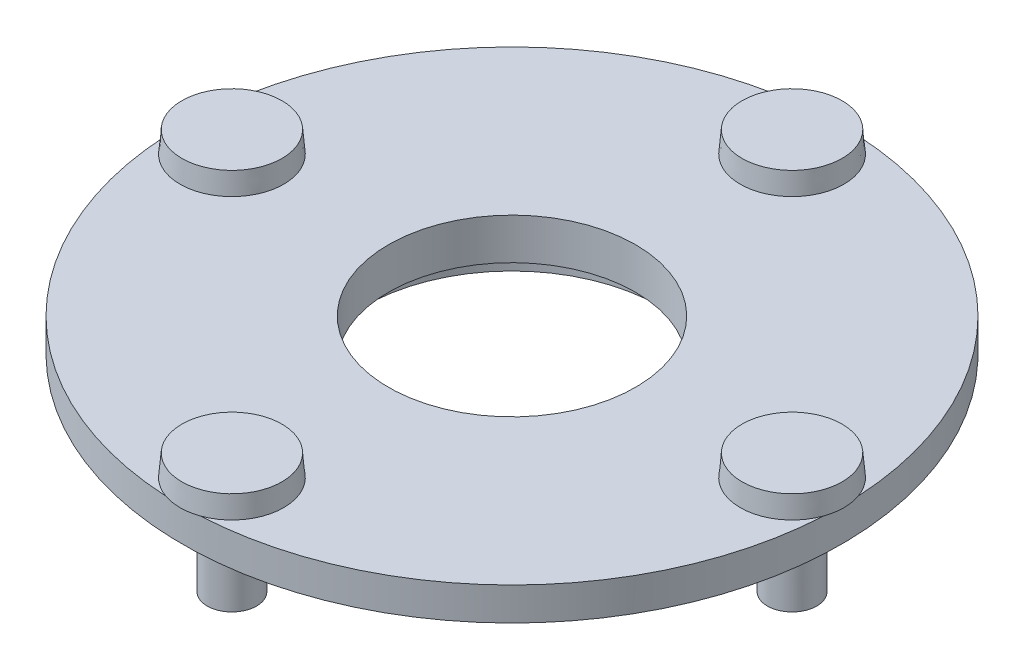
ISO-10303-21;
HEADER;
FILE_DESCRIPTION(('STEP AP214'),'2;1');
FILE_NAME('part.step','',(''),(''),'','','');
FILE_SCHEMA(('AUTOMOTIVE_DESIGN { 1 0 10303 214 1 1 1 1 }'));
ENDSEC;
DATA;
#1=APPLICATION_CONTEXT('core data for automotive mechanical design processes');
#2=APPLICATION_PROTOCOL_DEFINITION('international standard','automotive_design',2000,#1);
#3=PRODUCT_CONTEXT('',#1,'mechanical');
#4=PRODUCT('Part','Part','',(#3));
#5=PRODUCT_RELATED_PRODUCT_CATEGORY('part','',(#4));
#6=PRODUCT_DEFINITION_FORMATION('','',#4);
#7=PRODUCT_DEFINITION_CONTEXT('part definition',#1,'design');
#8=PRODUCT_DEFINITION('design','',#6,#7);
#9=PRODUCT_DEFINITION_SHAPE('','',#8);
#10=(LENGTH_UNIT() NAMED_UNIT(*) SI_UNIT(.MILLI.,.METRE.));
#11=(NAMED_UNIT(*) PLANE_ANGLE_UNIT() SI_UNIT($,.RADIAN.));
#12=(NAMED_UNIT(*) SI_UNIT($,.STERADIAN.) SOLID_ANGLE_UNIT());
#13=UNCERTAINTY_MEASURE_WITH_UNIT(LENGTH_MEASURE(1.E-05),#10,'distance_accuracy_value','');
#14=(GEOMETRIC_REPRESENTATION_CONTEXT(3) GLOBAL_UNCERTAINTY_ASSIGNED_CONTEXT((#13)) GLOBAL_UNIT_ASSIGNED_CONTEXT((#10,
#11,#12)) REPRESENTATION_CONTEXT('',''));
#15=CARTESIAN_POINT('',(0.,0.,0.));
#16=DIRECTION('',(0.,0.,1.));
#17=DIRECTION('',(1.,0.,0.));
#18=AXIS2_PLACEMENT_3D('',#15,#16,#17);
#19=CARTESIAN_POINT('',(20.,2.,0.));
#20=DIRECTION('',(0.,1.,0.));
#21=DIRECTION('',(0.,0.,1.));
#22=AXIS2_PLACEMENT_3D('',#19,#20,#21);
#23=PLANE('',#22);
#24=CARTESIAN_POINT('',(-17.,2.,0.));
#25=DIRECTION('',(0.,1.,0.));
#26=DIRECTION('',(0.,0.,1.));
#27=AXIS2_PLACEMENT_3D('',#24,#25,#26);
#28=CIRCLE('',#27,1.5);
#29=CARTESIAN_POINT('',(-17.,2.,1.5));
#30=VERTEX_POINT('',#29);
#31=EDGE_CURVE('E150',#30,#30,#28,.F.);
#32=ORIENTED_EDGE('',*,*,#31,.F.);
#33=EDGE_LOOP('',(#32));
#34=FACE_BOUND('',#33,.T.);
#35=CARTESIAN_POINT('',(17.,2.,0.));
#36=DIRECTION('',(0.,1.,0.));
#37=DIRECTION('',(0.,0.,1.));
#38=AXIS2_PLACEMENT_3D('',#35,#36,#37);
#39=CIRCLE('',#38,1.5);
#40=CARTESIAN_POINT('',(17.,2.,1.5));
#41=VERTEX_POINT('',#40);
#42=EDGE_CURVE('E144',#41,#41,#39,.F.);
#43=ORIENTED_EDGE('',*,*,#42,.F.);
#44=EDGE_LOOP('',(#43));
#45=FACE_BOUND('',#44,.T.);
#46=CARTESIAN_POINT('',(0.,2.,0.));
#47=DIRECTION('',(0.,-1.,0.));
#48=DIRECTION('',(0.,0.,-1.));
#49=AXIS2_PLACEMENT_3D('',#46,#47,#48);
#50=CIRCLE('',#49,14.);
#51=CARTESIAN_POINT('',(0.,2.,-14.));
#52=VERTEX_POINT('',#51);
#53=EDGE_CURVE('E133',#52,#52,#50,.T.);
#54=ORIENTED_EDGE('',*,*,#53,.F.);
#55=EDGE_LOOP('',(#54));
#56=FACE_BOUND('',#55,.T.);
#57=CARTESIAN_POINT('',(0.,2.,0.));
#58=DIRECTION('',(0.,-1.,0.));
#59=DIRECTION('',(0.,0.,-1.));
#60=AXIS2_PLACEMENT_3D('',#57,#58,#59);
#61=CIRCLE('',#60,20.);
#62=CARTESIAN_POINT('',(0.,2.,-20.));
#63=VERTEX_POINT('',#62);
#64=EDGE_CURVE('E136',#63,#63,#61,.T.);
#65=ORIENTED_EDGE('',*,*,#64,.T.);
#66=EDGE_LOOP('',(#65));
#67=FACE_BOUND('',#66,.T.);
#68=CARTESIAN_POINT('',(0.,2.,17.));
#69=DIRECTION('',(0.,1.,0.));
#70=DIRECTION('',(0.,0.,1.));
#71=AXIS2_PLACEMENT_3D('',#68,#69,#70);
#72=CIRCLE('',#71,1.5);
#73=CARTESIAN_POINT('',(0.,2.,18.5));
#74=VERTEX_POINT('',#73);
#75=EDGE_CURVE('E147',#74,#74,#72,.F.);
#76=ORIENTED_EDGE('',*,*,#75,.F.);
#77=EDGE_LOOP('',(#76));
#78=FACE_BOUND('',#77,.T.);
#79=CARTESIAN_POINT('',(1.78065548281E-13,2.,-17.));
#80=DIRECTION('',(0.,1.,0.));
#81=DIRECTION('',(0.,0.,1.));
#82=AXIS2_PLACEMENT_3D('',#79,#80,#81);
#83=CIRCLE('',#82,1.5);
#84=CARTESIAN_POINT('',(1.78065548281E-13,2.,-15.5));
#85=VERTEX_POINT('',#84);
#86=EDGE_CURVE('E153',#85,#85,#83,.F.);
#87=ORIENTED_EDGE('',*,*,#86,.F.);
#88=EDGE_LOOP('',(#87));
#89=FACE_BOUND('',#88,.T.);
#90=ADVANCED_FACE('F41',(#34,#45,#56,#67,#78,#89),#23,.F.);
#91=CARTESIAN_POINT('',(7.5,4.,0.));
#92=DIRECTION('',(0.,1.,0.));
#93=DIRECTION('',(0.,0.,1.));
#94=AXIS2_PLACEMENT_3D('',#91,#92,#93);
#95=PLANE('',#94);
#96=CARTESIAN_POINT('',(0.,4.,0.));
#97=DIRECTION('',(0.,-1.,0.));
#98=DIRECTION('',(0.,0.,-1.));
#99=AXIS2_PLACEMENT_3D('',#96,#97,#98);
#100=CIRCLE('',#99,7.5);
#101=CARTESIAN_POINT('',(0.,4.,-7.5));
#102=VERTEX_POINT('',#101);
#103=EDGE_CURVE('E140',#102,#102,#100,.T.);
#104=ORIENTED_EDGE('',*,*,#103,.T.);
#105=EDGE_LOOP('',(#104));
#106=FACE_BOUND('',#105,.T.);
#107=CARTESIAN_POINT('',(0.,4.,0.));
#108=DIRECTION('',(0.,-1.,0.));
#109=DIRECTION('',(0.,0.,-1.));
#110=AXIS2_PLACEMENT_3D('',#107,#108,#109);
#111=CIRCLE('',#110,20.);
#112=CARTESIAN_POINT('',(1.04142112186732,4.,-19.9728676470588));
#113=VERTEX_POINT('',#112);
#114=CARTESIAN_POINT('',(19.9728676470588,4.,-1.04142112186716));
#115=VERTEX_POINT('',#114);
#116=EDGE_CURVE('E90',#113,#115,#111,.T.);
#117=ORIENTED_EDGE('',*,*,#116,.F.);
#118=CARTESIAN_POINT('',(1.78065548281E-13,4.,-17.));
#119=DIRECTION('',(0.,1.,0.));
#120=DIRECTION('',(1.,0.,0.));
#121=AXIS2_PLACEMENT_3D('',#118,#119,#120);
#122=CIRCLE('',#121,3.15);
#123=CARTESIAN_POINT('',(-1.0414211218669,4.,-19.9728676470588));
#124=VERTEX_POINT('',#123);
#125=EDGE_CURVE('E55',#124,#113,#122,.T.);
#126=ORIENTED_EDGE('',*,*,#125,.F.);
#127=CARTESIAN_POINT('',(-19.9728676470588,4.,-1.04142112186711));
#128=VERTEX_POINT('',#127);
#129=EDGE_CURVE('E89',#128,#124,#111,.T.);
#130=ORIENTED_EDGE('',*,*,#129,.F.);
#131=CARTESIAN_POINT('',(-17.,4.,0.));
#132=DIRECTION('',(0.,1.,0.));
#133=DIRECTION('',(0.,0.,-1.));
#134=AXIS2_PLACEMENT_3D('',#131,#132,#133);
#135=CIRCLE('',#134,3.15);
#136=CARTESIAN_POINT('',(-19.9728676470588,4.,1.04142112186711));
#137=VERTEX_POINT('',#136);
#138=EDGE_CURVE('E62',#137,#128,#135,.T.);
#139=ORIENTED_EDGE('',*,*,#138,.F.);
#140=CARTESIAN_POINT('',(-1.04142112186718,4.,19.9728676470588));
#141=VERTEX_POINT('',#140);
#142=EDGE_CURVE('E308',#141,#137,#111,.T.);
#143=ORIENTED_EDGE('',*,*,#142,.F.);
#144=CARTESIAN_POINT('',(0.,4.,17.));
#145=DIRECTION('',(0.,1.,0.));
#146=DIRECTION('',(-1.,0.,0.));
#147=AXIS2_PLACEMENT_3D('',#144,#145,#146);
#148=CIRCLE('',#147,3.15);
#149=CARTESIAN_POINT('',(1.04142112186704,4.,19.9728676470588));
#150=VERTEX_POINT('',#149);
#151=EDGE_CURVE('E110',#150,#141,#148,.T.);
#152=ORIENTED_EDGE('',*,*,#151,.F.);
#153=CARTESIAN_POINT('',(19.9728676470588,4.,1.04142112186715));
#154=VERTEX_POINT('',#153);
#155=EDGE_CURVE('E141',#154,#150,#111,.T.);
#156=ORIENTED_EDGE('',*,*,#155,.F.);
#157=CARTESIAN_POINT('',(17.,4.,0.));
#158=DIRECTION('',(0.,1.,0.));
#159=DIRECTION('',(0.,0.,1.));
#160=AXIS2_PLACEMENT_3D('',#157,#158,#159);
#161=CIRCLE('',#160,3.15);
#162=EDGE_CURVE('E121',#115,#154,#161,.T.);
#163=ORIENTED_EDGE('',*,*,#162,.F.);
#164=EDGE_LOOP('',(#117,#126,#130,#139,#143,#152,#156,#163));
#165=FACE_BOUND('',#164,.T.);
#166=ADVANCED_FACE('F94',(#106,#165),#95,.T.);
#167=CARTESIAN_POINT('',(0.,-5.17637943196313,0.));
#168=DIRECTION('',(0.,-1.,0.));
#169=DIRECTION('',(0.,0.,-1.));
#170=AXIS2_PLACEMENT_3D('',#167,#168,#169);
#171=CYLINDRICAL_SURFACE('',#170,7.5);
#172=CARTESIAN_POINT('',(0.,1.5,0.));
#173=DIRECTION('',(0.,-1.,0.));
#174=DIRECTION('',(0.,0.,-1.));
#175=AXIS2_PLACEMENT_3D('',#172,#173,#174);
#176=CIRCLE('',#175,7.5);
#177=CARTESIAN_POINT('',(0.,1.5,-7.5));
#178=VERTEX_POINT('',#177);
#179=EDGE_CURVE('E127',#178,#178,#176,.T.);
#180=ORIENTED_EDGE('',*,*,#179,.T.);
#181=EDGE_LOOP('',(#180));
#182=FACE_BOUND('',#181,.T.);
#183=ORIENTED_EDGE('',*,*,#103,.F.);
#184=EDGE_LOOP('',(#183));
#185=FACE_BOUND('',#184,.T.);
#186=ADVANCED_FACE('F182',(#182,#185),#171,.F.);
#187=CARTESIAN_POINT('',(0.,-5.17637943196313,0.));
#188=DIRECTION('',(0.,-1.,0.));
#189=DIRECTION('',(0.,0.,-1.));
#190=AXIS2_PLACEMENT_3D('',#187,#188,#189);
#191=CYLINDRICAL_SURFACE('',#190,20.);
#192=ORIENTED_EDGE('',*,*,#64,.F.);
#193=EDGE_LOOP('',(#192));
#194=FACE_BOUND('',#193,.T.);
#195=EDGE_CURVE('E138',#115,#154,#111,.T.);
#196=ORIENTED_EDGE('',*,*,#195,.T.);
#197=ORIENTED_EDGE('',*,*,#155,.T.);
#198=EDGE_CURVE('E312',#150,#141,#111,.T.);
#199=ORIENTED_EDGE('',*,*,#198,.T.);
#200=ORIENTED_EDGE('',*,*,#142,.T.);
#201=EDGE_CURVE('E102',#137,#128,#111,.T.);
#202=ORIENTED_EDGE('',*,*,#201,.T.);
#203=ORIENTED_EDGE('',*,*,#129,.T.);
#204=EDGE_CURVE('E83',#124,#113,#111,.T.);
#205=ORIENTED_EDGE('',*,*,#204,.T.);
#206=ORIENTED_EDGE('',*,*,#116,.T.);
#207=EDGE_LOOP('',(#196,#197,#199,#200,#202,#203,#205,#206));
#208=FACE_BOUND('',#207,.T.);
#209=ADVANCED_FACE('F100',(#194,#208),#191,.T.);
#210=CARTESIAN_POINT('',(7.5,0.,0.));
#211=DIRECTION('',(0.,-1.,0.));
#212=DIRECTION('',(0.,0.,-1.));
#213=AXIS2_PLACEMENT_3D('',#210,#211,#212);
#214=PLANE('',#213);
#215=CARTESIAN_POINT('',(0.,0.,0.));
#216=DIRECTION('',(0.,-1.,0.));
#217=DIRECTION('',(0.,0.,-1.));
#218=AXIS2_PLACEMENT_3D('',#215,#216,#217);
#219=CIRCLE('',#218,9.);
#220=CARTESIAN_POINT('',(0.,0.,-9.));
#221=VERTEX_POINT('',#220);
#222=EDGE_CURVE('E120',#221,#221,#219,.T.);
#223=ORIENTED_EDGE('',*,*,#222,.F.);
#224=EDGE_LOOP('',(#223));
#225=FACE_BOUND('',#224,.T.);
#226=CARTESIAN_POINT('',(0.,0.,0.));
#227=DIRECTION('',(0.,-1.,0.));
#228=DIRECTION('',(0.,0.,-1.));
#229=AXIS2_PLACEMENT_3D('',#226,#227,#228);
#230=CIRCLE('',#229,14.);
#231=CARTESIAN_POINT('',(0.,0.,-14.));
#232=VERTEX_POINT('',#231);
#233=EDGE_CURVE('E130',#232,#232,#230,.T.);
#234=ORIENTED_EDGE('',*,*,#233,.T.);
#235=EDGE_LOOP('',(#234));
#236=FACE_BOUND('',#235,.T.);
#237=ADVANCED_FACE('F191',(#225,#236),#214,.T.);
#238=CARTESIAN_POINT('',(0.,-1.23339827522804,0.));
#239=DIRECTION('',(0.,-1.,0.));
#240=DIRECTION('',(0.,0.,-1.));
#241=AXIS2_PLACEMENT_3D('',#238,#239,#240);
#242=CYLINDRICAL_SURFACE('',#241,14.);
#243=ORIENTED_EDGE('',*,*,#233,.F.);
#244=EDGE_LOOP('',(#243));
#245=FACE_BOUND('',#244,.T.);
#246=ORIENTED_EDGE('',*,*,#53,.T.);
#247=EDGE_LOOP('',(#246));
#248=FACE_BOUND('',#247,.T.);
#249=ADVANCED_FACE('F189',(#245,#248),#242,.T.);
#250=CARTESIAN_POINT('',(7.5,1.5,0.));
#251=DIRECTION('',(0.,1.,0.));
#252=DIRECTION('',(0.,0.,1.));
#253=AXIS2_PLACEMENT_3D('',#250,#251,#252);
#254=PLANE('',#253);
#255=ORIENTED_EDGE('',*,*,#179,.F.);
#256=EDGE_LOOP('',(#255));
#257=FACE_BOUND('',#256,.T.);
#258=CARTESIAN_POINT('',(0.,1.5,0.));
#259=DIRECTION('',(0.,-1.,0.));
#260=DIRECTION('',(0.,0.,-1.));
#261=AXIS2_PLACEMENT_3D('',#258,#259,#260);
#262=CIRCLE('',#261,9.);
#263=CARTESIAN_POINT('',(0.,1.5,-9.));
#264=VERTEX_POINT('',#263);
#265=EDGE_CURVE('E124',#264,#264,#262,.T.);
#266=ORIENTED_EDGE('',*,*,#265,.T.);
#267=EDGE_LOOP('',(#266));
#268=FACE_BOUND('',#267,.T.);
#269=ADVANCED_FACE('F249',(#257,#268),#254,.F.);
#270=CARTESIAN_POINT('',(0.,-1.23339827522804,0.));
#271=DIRECTION('',(0.,-1.,0.));
#272=DIRECTION('',(0.,0.,-1.));
#273=AXIS2_PLACEMENT_3D('',#270,#271,#272);
#274=CYLINDRICAL_SURFACE('',#273,9.);
#275=ORIENTED_EDGE('',*,*,#265,.F.);
#276=EDGE_LOOP('',(#275));
#277=FACE_BOUND('',#276,.T.);
#278=ORIENTED_EDGE('',*,*,#222,.T.);
#279=EDGE_LOOP('',(#278));
#280=FACE_BOUND('',#279,.T.);
#281=ADVANCED_FACE('F243',(#277,#280),#274,.F.);
#282=CARTESIAN_POINT('',(17.,5.3,0.));
#283=DIRECTION('',(0.,1.,0.));
#284=DIRECTION('',(0.,0.,1.));
#285=AXIS2_PLACEMENT_3D('',#282,#283,#284);
#286=PLANE('',#285);
#287=CARTESIAN_POINT('',(17.,5.3,0.));
#288=DIRECTION('',(0.,1.,0.));
#289=DIRECTION('',(0.,0.,1.));
#290=AXIS2_PLACEMENT_3D('',#287,#288,#289);
#291=CIRCLE('',#290,3.03626473741632);
#292=CARTESIAN_POINT('',(17.,5.3,3.03626473741632));
#293=VERTEX_POINT('',#292);
#294=EDGE_CURVE('E11',#293,#293,#291,.T.);
#295=ORIENTED_EDGE('',*,*,#294,.T.);
#296=EDGE_LOOP('',(#295));
#297=FACE_BOUND('',#296,.T.);
#298=ADVANCED_FACE('F240',(#297),#286,.T.);
#299=CARTESIAN_POINT('',(17.,4.,0.));
#300=DIRECTION('',(0.,1.,0.));
#301=DIRECTION('',(0.,0.,1.));
#302=AXIS2_PLACEMENT_3D('',#299,#300,#301);
#303=PLANE('',#302);
#304=ORIENTED_EDGE('',*,*,#195,.F.);
#305=EDGE_CURVE('E117',#154,#115,#161,.T.);
#306=ORIENTED_EDGE('',*,*,#305,.F.);
#307=EDGE_LOOP('',(#304,#306));
#308=FACE_BOUND('',#307,.T.);
#309=ADVANCED_FACE('F238',(#308),#303,.F.);
#310=CARTESIAN_POINT('',(17.,-2.,0.));
#311=DIRECTION('',(0.,1.,0.));
#312=DIRECTION('',(0.,0.,1.));
#313=AXIS2_PLACEMENT_3D('',#310,#311,#312);
#314=CYLINDRICAL_SURFACE('',#313,1.5);
#315=CARTESIAN_POINT('',(17.,-2.,0.));
#316=DIRECTION('',(0.,-1.,0.));
#317=DIRECTION('',(0.,0.,-1.));
#318=AXIS2_PLACEMENT_3D('',#315,#316,#317);
#319=CIRCLE('',#318,1.5);
#320=CARTESIAN_POINT('',(17.,-2.,-1.5));
#321=VERTEX_POINT('',#320);
#322=EDGE_CURVE('E114',#321,#321,#319,.T.);
#323=ORIENTED_EDGE('',*,*,#322,.F.);
#324=EDGE_LOOP('',(#323));
#325=FACE_BOUND('',#324,.T.);
#326=ORIENTED_EDGE('',*,*,#42,.T.);
#327=EDGE_LOOP('',(#326));
#328=FACE_BOUND('',#327,.T.);
#329=ADVANCED_FACE('F229',(#325,#328),#314,.T.);
#330=CARTESIAN_POINT('',(17.,-2.,0.));
#331=DIRECTION('',(0.,-1.,0.));
#332=DIRECTION('',(0.,0.,-1.));
#333=AXIS2_PLACEMENT_3D('',#330,#331,#332);
#334=PLANE('',#333);
#335=ORIENTED_EDGE('',*,*,#322,.T.);
#336=EDGE_LOOP('',(#335));
#337=FACE_BOUND('',#336,.T.);
#338=ADVANCED_FACE('F219',(#337),#334,.T.);
#339=CARTESIAN_POINT('',(0.,5.3,17.));
#340=DIRECTION('',(0.,1.,0.));
#341=DIRECTION('',(-1.,0.,0.));
#342=AXIS2_PLACEMENT_3D('',#339,#340,#341);
#343=PLANE('',#342);
#344=CARTESIAN_POINT('',(0.,5.3,17.));
#345=DIRECTION('',(0.,1.,0.));
#346=DIRECTION('',(0.,0.,1.));
#347=AXIS2_PLACEMENT_3D('',#344,#345,#346);
#348=CIRCLE('',#347,3.03626473741632);
#349=CARTESIAN_POINT('',(0.,5.3,20.0362647374163));
#350=VERTEX_POINT('',#349);
#351=EDGE_CURVE('E156',#350,#350,#348,.T.);
#352=ORIENTED_EDGE('',*,*,#351,.T.);
#353=EDGE_LOOP('',(#352));
#354=FACE_BOUND('',#353,.T.);
#355=ADVANCED_FACE('F216',(#354),#343,.T.);
#356=CARTESIAN_POINT('',(0.,4.,17.));
#357=DIRECTION('',(0.,1.,0.));
#358=DIRECTION('',(-1.,0.,0.));
#359=AXIS2_PLACEMENT_3D('',#356,#357,#358);
#360=PLANE('',#359);
#361=ORIENTED_EDGE('',*,*,#198,.F.);
#362=EDGE_CURVE('E111',#141,#150,#148,.T.);
#363=ORIENTED_EDGE('',*,*,#362,.F.);
#364=EDGE_LOOP('',(#361,#363));
#365=FACE_BOUND('',#364,.T.);
#366=ADVANCED_FACE('F218',(#365),#360,.F.);
#367=CARTESIAN_POINT('',(-17.,5.3,0.));
#368=DIRECTION('',(0.,1.,0.));
#369=DIRECTION('',(0.,0.,-1.));
#370=AXIS2_PLACEMENT_3D('',#367,#368,#369);
#371=PLANE('',#370);
#372=CARTESIAN_POINT('',(-17.,5.3,0.));
#373=DIRECTION('',(0.,1.,0.));
#374=DIRECTION('',(0.,0.,1.));
#375=AXIS2_PLACEMENT_3D('',#372,#373,#374);
#376=CIRCLE('',#375,3.03626473741632);
#377=CARTESIAN_POINT('',(-17.,5.3,3.03626473741632));
#378=VERTEX_POINT('',#377);
#379=EDGE_CURVE('E159',#378,#378,#376,.T.);
#380=ORIENTED_EDGE('',*,*,#379,.T.);
#381=EDGE_LOOP('',(#380));
#382=FACE_BOUND('',#381,.T.);
#383=ADVANCED_FACE('F226',(#382),#371,.T.);
#384=CARTESIAN_POINT('',(-17.,4.,0.));
#385=DIRECTION('',(0.,1.,0.));
#386=DIRECTION('',(0.,0.,-1.));
#387=AXIS2_PLACEMENT_3D('',#384,#385,#386);
#388=PLANE('',#387);
#389=ORIENTED_EDGE('',*,*,#201,.F.);
#390=EDGE_CURVE('E105',#128,#137,#135,.T.);
#391=ORIENTED_EDGE('',*,*,#390,.F.);
#392=EDGE_LOOP('',(#389,#391));
#393=FACE_BOUND('',#392,.T.);
#394=ADVANCED_FACE('F233',(#393),#388,.F.);
#395=CARTESIAN_POINT('',(1.78065548281E-13,5.3,-17.));
#396=DIRECTION('',(0.,1.,0.));
#397=DIRECTION('',(1.,0.,0.));
#398=AXIS2_PLACEMENT_3D('',#395,#396,#397);
#399=PLANE('',#398);
#400=CARTESIAN_POINT('',(1.78065548281E-13,5.3,-17.));
#401=DIRECTION('',(0.,1.,0.));
#402=DIRECTION('',(0.,0.,1.));
#403=AXIS2_PLACEMENT_3D('',#400,#401,#402);
#404=CIRCLE('',#403,3.03626473741632);
#405=CARTESIAN_POINT('',(1.78065548281E-13,5.3,-13.9637352625837));
#406=VERTEX_POINT('',#405);
#407=EDGE_CURVE('E49',#406,#406,#404,.T.);
#408=ORIENTED_EDGE('',*,*,#407,.T.);
#409=EDGE_LOOP('',(#408));
#410=FACE_BOUND('',#409,.T.);
#411=ADVANCED_FACE('F164',(#410),#399,.T.);
#412=CARTESIAN_POINT('',(1.78065548281E-13,4.,-17.));
#413=DIRECTION('',(0.,1.,0.));
#414=DIRECTION('',(1.,0.,0.));
#415=AXIS2_PLACEMENT_3D('',#412,#413,#414);
#416=PLANE('',#415);
#417=ORIENTED_EDGE('',*,*,#204,.F.);
#418=EDGE_CURVE('E85',#113,#124,#122,.T.);
#419=ORIENTED_EDGE('',*,*,#418,.F.);
#420=EDGE_LOOP('',(#417,#419));
#421=FACE_BOUND('',#420,.T.);
#422=ADVANCED_FACE('F84',(#421),#416,.F.);
#423=CARTESIAN_POINT('',(0.,-2.,17.));
#424=DIRECTION('',(0.,1.,0.));
#425=DIRECTION('',(0.,0.,1.));
#426=AXIS2_PLACEMENT_3D('',#423,#424,#425);
#427=CYLINDRICAL_SURFACE('',#426,1.5);
#428=CARTESIAN_POINT('',(0.,-2.,17.));
#429=DIRECTION('',(0.,-1.,0.));
#430=DIRECTION('',(1.,0.,0.));
#431=AXIS2_PLACEMENT_3D('',#428,#429,#430);
#432=CIRCLE('',#431,1.5);
#433=CARTESIAN_POINT('',(1.49999999999994,-2.,17.));
#434=VERTEX_POINT('',#433);
#435=EDGE_CURVE('E97',#434,#434,#432,.T.);
#436=ORIENTED_EDGE('',*,*,#435,.F.);
#437=EDGE_LOOP('',(#436));
#438=FACE_BOUND('',#437,.T.);
#439=ORIENTED_EDGE('',*,*,#75,.T.);
#440=EDGE_LOOP('',(#439));
#441=FACE_BOUND('',#440,.T.);
#442=ADVANCED_FACE('F293',(#438,#441),#427,.T.);
#443=CARTESIAN_POINT('',(0.,-2.,17.));
#444=DIRECTION('',(0.,-1.,0.));
#445=DIRECTION('',(1.,0.,0.));
#446=AXIS2_PLACEMENT_3D('',#443,#444,#445);
#447=PLANE('',#446);
#448=ORIENTED_EDGE('',*,*,#435,.T.);
#449=EDGE_LOOP('',(#448));
#450=FACE_BOUND('',#449,.T.);
#451=ADVANCED_FACE('F289',(#450),#447,.T.);
#452=CARTESIAN_POINT('',(-17.,-2.,0.));
#453=DIRECTION('',(0.,1.,0.));
#454=DIRECTION('',(0.,0.,1.));
#455=AXIS2_PLACEMENT_3D('',#452,#453,#454);
#456=CYLINDRICAL_SURFACE('',#455,1.5);
#457=CARTESIAN_POINT('',(-17.,-2.,0.));
#458=DIRECTION('',(0.,-1.,0.));
#459=DIRECTION('',(0.,0.,1.));
#460=AXIS2_PLACEMENT_3D('',#457,#458,#459);
#461=CIRCLE('',#460,1.5);
#462=CARTESIAN_POINT('',(-17.,-2.,1.5));
#463=VERTEX_POINT('',#462);
#464=EDGE_CURVE('E439',#463,#463,#461,.T.);
#465=ORIENTED_EDGE('',*,*,#464,.F.);
#466=EDGE_LOOP('',(#465));
#467=FACE_BOUND('',#466,.T.);
#468=ORIENTED_EDGE('',*,*,#31,.T.);
#469=EDGE_LOOP('',(#468));
#470=FACE_BOUND('',#469,.T.);
#471=ADVANCED_FACE('F282',(#467,#470),#456,.T.);
#472=CARTESIAN_POINT('',(-17.,-2.,0.));
#473=DIRECTION('',(0.,-1.,0.));
#474=DIRECTION('',(0.,0.,1.));
#475=AXIS2_PLACEMENT_3D('',#472,#473,#474);
#476=PLANE('',#475);
#477=ORIENTED_EDGE('',*,*,#464,.T.);
#478=EDGE_LOOP('',(#477));
#479=FACE_BOUND('',#478,.T.);
#480=ADVANCED_FACE('F275',(#479),#476,.T.);
#481=CARTESIAN_POINT('',(1.78065548281E-13,-2.,-17.));
#482=DIRECTION('',(0.,1.,0.));
#483=DIRECTION('',(0.,0.,1.));
#484=AXIS2_PLACEMENT_3D('',#481,#482,#483);
#485=CYLINDRICAL_SURFACE('',#484,1.5);
#486=CARTESIAN_POINT('',(1.78065548281E-13,-2.,-17.));
#487=DIRECTION('',(0.,-1.,0.));
#488=DIRECTION('',(-1.,0.,0.));
#489=AXIS2_PLACEMENT_3D('',#486,#487,#488);
#490=CIRCLE('',#489,1.5);
#491=CARTESIAN_POINT('',(-1.49999999999982,-2.,-17.));
#492=VERTEX_POINT('',#491);
#493=EDGE_CURVE('E441',#492,#492,#490,.T.);
#494=ORIENTED_EDGE('',*,*,#493,.F.);
#495=EDGE_LOOP('',(#494));
#496=FACE_BOUND('',#495,.T.);
#497=ORIENTED_EDGE('',*,*,#86,.T.);
#498=EDGE_LOOP('',(#497));
#499=FACE_BOUND('',#498,.T.);
#500=ADVANCED_FACE('F208',(#496,#499),#485,.T.);
#501=CARTESIAN_POINT('',(1.78065548281E-13,-2.,-17.));
#502=DIRECTION('',(0.,-1.,0.));
#503=DIRECTION('',(-1.,0.,0.));
#504=AXIS2_PLACEMENT_3D('',#501,#502,#503);
#505=PLANE('',#504);
#506=ORIENTED_EDGE('',*,*,#493,.T.);
#507=EDGE_LOOP('',(#506));
#508=FACE_BOUND('',#507,.T.);
#509=ADVANCED_FACE('F202',(#508),#505,.T.);
#510=CARTESIAN_POINT('',(0.,5.3,17.));
#511=DIRECTION('',(0.,-1.,0.));
#512=DIRECTION('',(0.,0.,-1.));
#513=AXIS2_PLACEMENT_3D('',#510,#511,#512);
#514=CONICAL_SURFACE('',#513,3.03626473741632,0.0872664625997136);
#515=ORIENTED_EDGE('',*,*,#151,.T.);
#516=ORIENTED_EDGE('',*,*,#362,.T.);
#517=EDGE_LOOP('',(#515,#516));
#518=FACE_BOUND('',#517,.T.);
#519=ORIENTED_EDGE('',*,*,#351,.F.);
#520=EDGE_LOOP('',(#519));
#521=FACE_BOUND('',#520,.T.);
#522=ADVANCED_FACE('F172',(#518,#521),#514,.T.);
#523=CARTESIAN_POINT('',(-17.,5.3,0.));
#524=DIRECTION('',(0.,-1.,0.));
#525=DIRECTION('',(0.,0.,-1.));
#526=AXIS2_PLACEMENT_3D('',#523,#524,#525);
#527=CONICAL_SURFACE('',#526,3.03626473741632,0.0872664625997136);
#528=ORIENTED_EDGE('',*,*,#138,.T.);
#529=ORIENTED_EDGE('',*,*,#390,.T.);
#530=EDGE_LOOP('',(#528,#529));
#531=FACE_BOUND('',#530,.T.);
#532=ORIENTED_EDGE('',*,*,#379,.F.);
#533=EDGE_LOOP('',(#532));
#534=FACE_BOUND('',#533,.T.);
#535=ADVANCED_FACE('F166',(#531,#534),#527,.T.);
#536=CARTESIAN_POINT('',(1.78065548281E-13,5.3,-17.));
#537=DIRECTION('',(0.,-1.,0.));
#538=DIRECTION('',(0.,0.,-1.));
#539=AXIS2_PLACEMENT_3D('',#536,#537,#538);
#540=CONICAL_SURFACE('',#539,3.03626473741632,0.0872664625997136);
#541=ORIENTED_EDGE('',*,*,#125,.T.);
#542=ORIENTED_EDGE('',*,*,#418,.T.);
#543=EDGE_LOOP('',(#541,#542));
#544=FACE_BOUND('',#543,.T.);
#545=ORIENTED_EDGE('',*,*,#407,.F.);
#546=EDGE_LOOP('',(#545));
#547=FACE_BOUND('',#546,.T.);
#548=ADVANCED_FACE('F103',(#544,#547),#540,.T.);
#549=CARTESIAN_POINT('',(17.,5.3,0.));
#550=DIRECTION('',(0.,-1.,0.));
#551=DIRECTION('',(0.,0.,-1.));
#552=AXIS2_PLACEMENT_3D('',#549,#550,#551);
#553=CONICAL_SURFACE('',#552,3.03626473741632,0.0872664625997136);
#554=ORIENTED_EDGE('',*,*,#162,.T.);
#555=ORIENTED_EDGE('',*,*,#305,.T.);
#556=EDGE_LOOP('',(#554,#555));
#557=FACE_BOUND('',#556,.T.);
#558=ORIENTED_EDGE('',*,*,#294,.F.);
#559=EDGE_LOOP('',(#558));
#560=FACE_BOUND('',#559,.T.);
#561=ADVANCED_FACE('F43',(#557,#560),#553,.T.);
#562=CLOSED_SHELL('',(#90,#166,#186,#209,#237,#249,#269,#281,#298,#309,#329,#338,#355,#366,#383,
#394,#411,#422,#442,#451,#471,#480,#500,#509,#522,#535,#548,#561));
#563=MANIFOLD_SOLID_BREP('B2',#562);
#564=ADVANCED_BREP_SHAPE_REPRESENTATION('',(#18,#563),#14);
#565=SHAPE_DEFINITION_REPRESENTATION(#9,#564);
ENDSEC;
END-ISO-10303-21;
